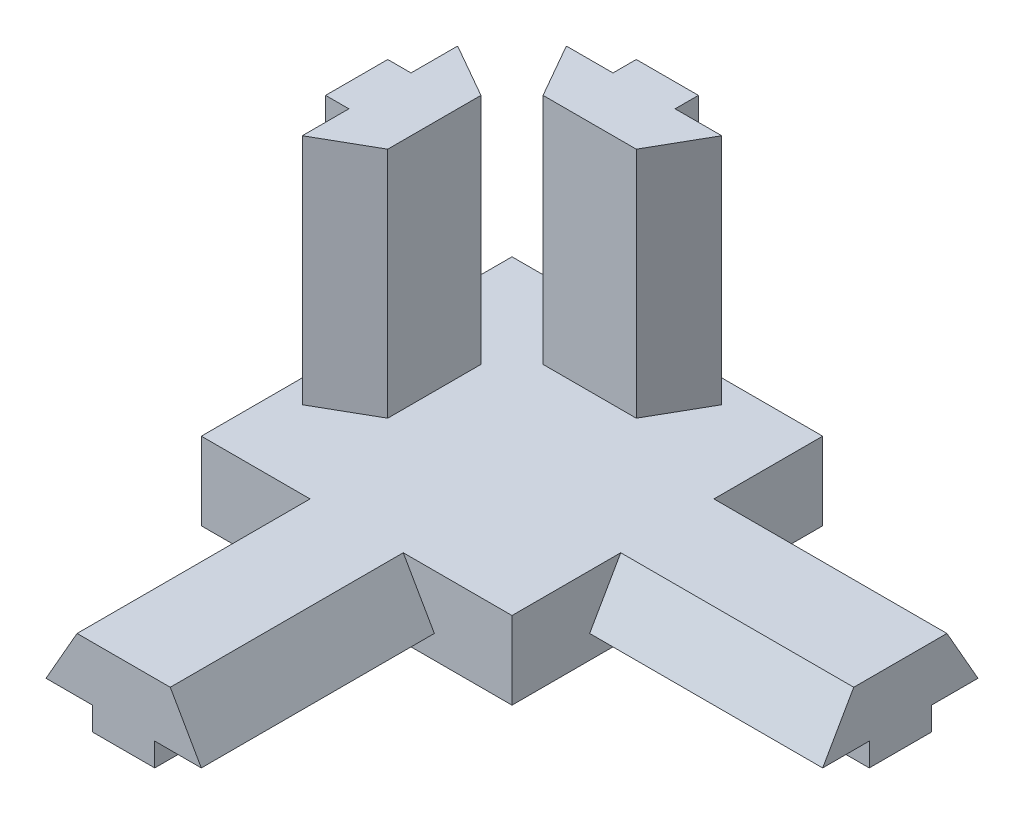
ISO-10303-21;
HEADER;
FILE_DESCRIPTION(('STEP AP214'),'2;1');
FILE_NAME('part.step','',(''),(''),'','','');
FILE_SCHEMA(('AUTOMOTIVE_DESIGN { 1 0 10303 214 1 1 1 1 }'));
ENDSEC;
DATA;
#1=APPLICATION_CONTEXT('core data for automotive mechanical design processes');
#2=APPLICATION_PROTOCOL_DEFINITION('international standard','automotive_design',2000,#1);
#3=PRODUCT_CONTEXT('',#1,'mechanical');
#4=PRODUCT('Part','Part','',(#3));
#5=PRODUCT_RELATED_PRODUCT_CATEGORY('part','',(#4));
#6=PRODUCT_DEFINITION_FORMATION('','',#4);
#7=PRODUCT_DEFINITION_CONTEXT('part definition',#1,'design');
#8=PRODUCT_DEFINITION('design','',#6,#7);
#9=PRODUCT_DEFINITION_SHAPE('','',#8);
#10=(LENGTH_UNIT() NAMED_UNIT(*) SI_UNIT(.MILLI.,.METRE.));
#11=(NAMED_UNIT(*) PLANE_ANGLE_UNIT() SI_UNIT($,.RADIAN.));
#12=(NAMED_UNIT(*) SI_UNIT($,.STERADIAN.) SOLID_ANGLE_UNIT());
#13=UNCERTAINTY_MEASURE_WITH_UNIT(LENGTH_MEASURE(1.E-05),#10,'distance_accuracy_value','');
#14=(GEOMETRIC_REPRESENTATION_CONTEXT(3) GLOBAL_UNCERTAINTY_ASSIGNED_CONTEXT((#13)) GLOBAL_UNIT_ASSIGNED_CONTEXT((#10,
#11,#12)) REPRESENTATION_CONTEXT('',''));
#15=CARTESIAN_POINT('',(0.,0.,0.));
#16=DIRECTION('',(0.,0.,1.));
#17=DIRECTION('',(1.,0.,0.));
#18=AXIS2_PLACEMENT_3D('',#15,#16,#17);
#19=CARTESIAN_POINT('',(-10.,2.5,10.));
#20=DIRECTION('',(0.,0.,-1.));
#21=DIRECTION('',(-1.,0.,0.));
#22=AXIS2_PLACEMENT_3D('',#19,#20,#21);
#23=PLANE('',#22);
#24=DIRECTION('',(-0.496138938356834,0.868243142124459,0.));
#25=VECTOR('',#24,1.);
#26=CARTESIAN_POINT('',(2.99999999999996,2.5,10.));
#27=LINE('',#26,#25);
#28=CARTESIAN_POINT('',(4.99999999999997,-1.,10.));
#29=VERTEX_POINT('',#28);
#30=CARTESIAN_POINT('',(2.99999999999996,2.5,10.));
#31=VERTEX_POINT('',#30);
#32=EDGE_CURVE('E55',#29,#31,#27,.T.);
#33=ORIENTED_EDGE('',*,*,#32,.F.);
#34=DIRECTION('',(1.,0.,0.));
#35=VECTOR('',#34,1.);
#36=CARTESIAN_POINT('',(4.99999999999997,-1.,10.));
#37=LINE('',#36,#35);
#38=CARTESIAN_POINT('',(1.99999999999997,-1.,10.));
#39=VERTEX_POINT('',#38);
#40=EDGE_CURVE('E59',#39,#29,#37,.T.);
#41=ORIENTED_EDGE('',*,*,#40,.F.);
#42=DIRECTION('',(0.,1.,0.));
#43=VECTOR('',#42,1.);
#44=CARTESIAN_POINT('',(1.99999999999997,-1.,10.));
#45=LINE('',#44,#43);
#46=CARTESIAN_POINT('',(1.99999999999997,-2.5,10.));
#47=VERTEX_POINT('',#46);
#48=EDGE_CURVE('E620',#47,#39,#45,.T.);
#49=ORIENTED_EDGE('',*,*,#48,.F.);
#50=DIRECTION('',(1.,0.,0.));
#51=VECTOR('',#50,1.);
#52=CARTESIAN_POINT('',(-10.,-2.5,10.));
#53=LINE('',#52,#51);
#54=CARTESIAN_POINT('',(10.,-2.5,10.));
#55=VERTEX_POINT('',#54);
#56=EDGE_CURVE('E583',#47,#55,#53,.T.);
#57=ORIENTED_EDGE('',*,*,#56,.T.);
#58=DIRECTION('',(0.,-1.,0.));
#59=VECTOR('',#58,1.);
#60=CARTESIAN_POINT('',(10.,2.5,10.));
#61=LINE('',#60,#59);
#62=CARTESIAN_POINT('',(10.,2.5,10.));
#63=VERTEX_POINT('',#62);
#64=EDGE_CURVE('E573',#63,#55,#61,.T.);
#65=ORIENTED_EDGE('',*,*,#64,.F.);
#66=DIRECTION('',(1.,0.,0.));
#67=VECTOR('',#66,1.);
#68=CARTESIAN_POINT('',(-10.,2.5,10.));
#69=LINE('',#68,#67);
#70=EDGE_CURVE('E568',#31,#63,#69,.T.);
#71=ORIENTED_EDGE('',*,*,#70,.F.);
#72=EDGE_LOOP('',(#33,#41,#49,#57,#65,#71));
#73=FACE_BOUND('',#72,.T.);
#74=ADVANCED_FACE('F39',(#73),#23,.F.);
#75=DIRECTION('',(-0.496138938356834,-0.868243142124459,0.));
#76=VECTOR('',#75,1.);
#77=CARTESIAN_POINT('',(-5.00000000000003,-1.,9.99999999999998));
#78=LINE('',#77,#76);
#79=CARTESIAN_POINT('',(-3.00000000000004,2.5,9.99999999999999));
#80=VERTEX_POINT('',#79);
#81=CARTESIAN_POINT('',(-5.00000000000003,-1.,9.99999999999998));
#82=VERTEX_POINT('',#81);
#83=EDGE_CURVE('E296',#80,#82,#78,.T.);
#84=ORIENTED_EDGE('',*,*,#83,.F.);
#85=CARTESIAN_POINT('',(-10.,2.5,10.));
#86=VERTEX_POINT('',#85);
#87=EDGE_CURVE('E569',#86,#80,#69,.T.);
#88=ORIENTED_EDGE('',*,*,#87,.F.);
#89=DIRECTION('',(0.,-1.,0.));
#90=VECTOR('',#89,1.);
#91=CARTESIAN_POINT('',(-10.,2.5,10.));
#92=LINE('',#91,#90);
#93=CARTESIAN_POINT('',(-10.,-2.5,10.));
#94=VERTEX_POINT('',#93);
#95=EDGE_CURVE('E590',#86,#94,#92,.T.);
#96=ORIENTED_EDGE('',*,*,#95,.T.);
#97=CARTESIAN_POINT('',(-2.00000000000004,-2.5,10.));
#98=VERTEX_POINT('',#97);
#99=EDGE_CURVE('E584',#94,#98,#53,.T.);
#100=ORIENTED_EDGE('',*,*,#99,.T.);
#101=DIRECTION('',(0.,-1.,0.));
#102=VECTOR('',#101,1.);
#103=CARTESIAN_POINT('',(-2.00000000000004,-2.5,9.99999999999999));
#104=LINE('',#103,#102);
#105=CARTESIAN_POINT('',(-2.00000000000004,-1.,9.99999999999999));
#106=VERTEX_POINT('',#105);
#107=EDGE_CURVE('E615',#106,#98,#104,.T.);
#108=ORIENTED_EDGE('',*,*,#107,.F.);
#109=DIRECTION('',(1.,0.,0.));
#110=VECTOR('',#109,1.);
#111=CARTESIAN_POINT('',(-2.00000000000004,-1.,9.99999999999999));
#112=LINE('',#111,#110);
#113=EDGE_CURVE('E621',#82,#106,#112,.T.);
#114=ORIENTED_EDGE('',*,*,#113,.F.);
#115=EDGE_LOOP('',(#84,#88,#96,#100,#108,#114));
#116=FACE_BOUND('',#115,.T.);
#117=ADVANCED_FACE('F614',(#116),#23,.F.);
#118=CARTESIAN_POINT('',(10.,2.5,10.));
#119=DIRECTION('',(-1.,0.,0.));
#120=DIRECTION('',(0.,0.,1.));
#121=AXIS2_PLACEMENT_3D('',#118,#119,#120);
#122=PLANE('',#121);
#123=DIRECTION('',(0.,0.868243142124459,0.496138938356834));
#124=VECTOR('',#123,1.);
#125=CARTESIAN_POINT('',(10.,2.5,-3.));
#126=LINE('',#125,#124);
#127=CARTESIAN_POINT('',(10.,-1.,-5.));
#128=VERTEX_POINT('',#127);
#129=CARTESIAN_POINT('',(10.,2.5,-3.));
#130=VERTEX_POINT('',#129);
#131=EDGE_CURVE('E314',#128,#130,#126,.T.);
#132=ORIENTED_EDGE('',*,*,#131,.F.);
#133=DIRECTION('',(0.,0.,-1.));
#134=VECTOR('',#133,1.);
#135=CARTESIAN_POINT('',(10.,-1.,-5.));
#136=LINE('',#135,#134);
#137=CARTESIAN_POINT('',(10.,-1.,-2.));
#138=VERTEX_POINT('',#137);
#139=EDGE_CURVE('E347',#138,#128,#136,.T.);
#140=ORIENTED_EDGE('',*,*,#139,.F.);
#141=DIRECTION('',(0.,1.,0.));
#142=VECTOR('',#141,1.);
#143=CARTESIAN_POINT('',(10.,-1.,-2.));
#144=LINE('',#143,#142);
#145=CARTESIAN_POINT('',(10.,-2.5,-2.));
#146=VERTEX_POINT('',#145);
#147=EDGE_CURVE('E343',#146,#138,#144,.T.);
#148=ORIENTED_EDGE('',*,*,#147,.F.);
#149=DIRECTION('',(0.,0.,-1.));
#150=VECTOR('',#149,1.);
#151=CARTESIAN_POINT('',(10.,-2.5,10.));
#152=LINE('',#151,#150);
#153=CARTESIAN_POINT('',(10.,-2.5,-10.));
#154=VERTEX_POINT('',#153);
#155=EDGE_CURVE('E532',#146,#154,#152,.T.);
#156=ORIENTED_EDGE('',*,*,#155,.T.);
#157=DIRECTION('',(0.,-1.,0.));
#158=VECTOR('',#157,1.);
#159=CARTESIAN_POINT('',(10.,2.5,-10.));
#160=LINE('',#159,#158);
#161=CARTESIAN_POINT('',(10.,2.5,-10.));
#162=VERTEX_POINT('',#161);
#163=EDGE_CURVE('E11',#162,#154,#160,.T.);
#164=ORIENTED_EDGE('',*,*,#163,.F.);
#165=DIRECTION('',(0.,0.,-1.));
#166=VECTOR('',#165,1.);
#167=CARTESIAN_POINT('',(10.,2.5,10.));
#168=LINE('',#167,#166);
#169=EDGE_CURVE('E558',#130,#162,#168,.T.);
#170=ORIENTED_EDGE('',*,*,#169,.F.);
#171=EDGE_LOOP('',(#132,#140,#148,#156,#164,#170));
#172=FACE_BOUND('',#171,.T.);
#173=ADVANCED_FACE('F41',(#172),#122,.F.);
#174=DIRECTION('',(0.,-0.868243142124459,0.496138938356834));
#175=VECTOR('',#174,1.);
#176=CARTESIAN_POINT('',(10.,-1.,5.));
#177=LINE('',#176,#175);
#178=CARTESIAN_POINT('',(10.,2.5,3.));
#179=VERTEX_POINT('',#178);
#180=CARTESIAN_POINT('',(10.,-1.,5.));
#181=VERTEX_POINT('',#180);
#182=EDGE_CURVE('E298',#179,#181,#177,.T.);
#183=ORIENTED_EDGE('',*,*,#182,.F.);
#184=EDGE_CURVE('E553',#63,#179,#168,.T.);
#185=ORIENTED_EDGE('',*,*,#184,.F.);
#186=ORIENTED_EDGE('',*,*,#64,.T.);
#187=CARTESIAN_POINT('',(10.,-2.5,2.));
#188=VERTEX_POINT('',#187);
#189=EDGE_CURVE('E574',#55,#188,#152,.T.);
#190=ORIENTED_EDGE('',*,*,#189,.T.);
#191=DIRECTION('',(0.,-1.,0.));
#192=VECTOR('',#191,1.);
#193=CARTESIAN_POINT('',(10.,-2.5,2.));
#194=LINE('',#193,#192);
#195=CARTESIAN_POINT('',(10.,-1.,2.));
#196=VERTEX_POINT('',#195);
#197=EDGE_CURVE('E339',#196,#188,#194,.T.);
#198=ORIENTED_EDGE('',*,*,#197,.F.);
#199=DIRECTION('',(0.,0.,-1.));
#200=VECTOR('',#199,1.);
#201=CARTESIAN_POINT('',(10.,-1.,2.));
#202=LINE('',#201,#200);
#203=EDGE_CURVE('E303',#181,#196,#202,.T.);
#204=ORIENTED_EDGE('',*,*,#203,.F.);
#205=EDGE_LOOP('',(#183,#185,#186,#190,#198,#204));
#206=FACE_BOUND('',#205,.T.);
#207=ADVANCED_FACE('F711',(#206),#122,.F.);
#208=CARTESIAN_POINT('',(-10.,2.5,-10.));
#209=DIRECTION('',(0.,0.,1.));
#210=DIRECTION('',(1.,0.,0.));
#211=AXIS2_PLACEMENT_3D('',#208,#209,#210);
#212=PLANE('',#211);
#213=DIRECTION('',(-1.,0.,0.));
#214=VECTOR('',#213,1.);
#215=CARTESIAN_POINT('',(-10.,-2.5,-10.));
#216=LINE('',#215,#214);
#217=CARTESIAN_POINT('',(-10.,-2.5,-10.));
#218=VERTEX_POINT('',#217);
#219=EDGE_CURVE('E577',#154,#218,#216,.T.);
#220=ORIENTED_EDGE('',*,*,#219,.T.);
#221=DIRECTION('',(0.,-1.,0.));
#222=VECTOR('',#221,1.);
#223=CARTESIAN_POINT('',(-10.,2.5,-10.));
#224=LINE('',#223,#222);
#225=CARTESIAN_POINT('',(-10.,2.5,-10.));
#226=VERTEX_POINT('',#225);
#227=EDGE_CURVE('E48',#226,#218,#224,.T.);
#228=ORIENTED_EDGE('',*,*,#227,.F.);
#229=DIRECTION('',(-1.,0.,0.));
#230=VECTOR('',#229,1.);
#231=CARTESIAN_POINT('',(-10.,2.5,-10.));
#232=LINE('',#231,#230);
#233=CARTESIAN_POINT('',(-2.,2.5,-10.));
#234=VERTEX_POINT('',#233);
#235=EDGE_CURVE('E557',#234,#226,#232,.T.);
#236=ORIENTED_EDGE('',*,*,#235,.F.);
#237=DIRECTION('',(0.,-1.,0.));
#238=VECTOR('',#237,1.);
#239=CARTESIAN_POINT('',(-2.,17.5,-10.));
#240=LINE('',#239,#238);
#241=CARTESIAN_POINT('',(-2.,17.5,-10.));
#242=VERTEX_POINT('',#241);
#243=EDGE_CURVE('E533',#242,#234,#240,.T.);
#244=ORIENTED_EDGE('',*,*,#243,.F.);
#245=DIRECTION('',(1.,0.,0.));
#246=VECTOR('',#245,1.);
#247=CARTESIAN_POINT('',(-2.,17.5,-10.));
#248=LINE('',#247,#246);
#249=CARTESIAN_POINT('',(2.,17.5,-10.));
#250=VERTEX_POINT('',#249);
#251=EDGE_CURVE('E498',#242,#250,#248,.T.);
#252=ORIENTED_EDGE('',*,*,#251,.T.);
#253=DIRECTION('',(0.,-1.,0.));
#254=VECTOR('',#253,1.);
#255=CARTESIAN_POINT('',(2.,17.5,-10.));
#256=LINE('',#255,#254);
#257=CARTESIAN_POINT('',(2.,2.5,-10.));
#258=VERTEX_POINT('',#257);
#259=EDGE_CURVE('E529',#250,#258,#256,.T.);
#260=ORIENTED_EDGE('',*,*,#259,.T.);
#261=EDGE_CURVE('E559',#162,#258,#232,.T.);
#262=ORIENTED_EDGE('',*,*,#261,.F.);
#263=ORIENTED_EDGE('',*,*,#163,.T.);
#264=EDGE_LOOP('',(#220,#228,#236,#244,#252,#260,#262,#263));
#265=FACE_BOUND('',#264,.T.);
#266=ADVANCED_FACE('F731',(#265),#212,.F.);
#267=CARTESIAN_POINT('',(-10.,2.5,10.));
#268=DIRECTION('',(1.,0.,0.));
#269=DIRECTION('',(0.,0.,-1.));
#270=AXIS2_PLACEMENT_3D('',#267,#268,#269);
#271=PLANE('',#270);
#272=DIRECTION('',(0.,0.,1.));
#273=VECTOR('',#272,1.);
#274=CARTESIAN_POINT('',(-10.,-2.5,10.));
#275=LINE('',#274,#273);
#276=EDGE_CURVE('E580',#218,#94,#275,.T.);
#277=ORIENTED_EDGE('',*,*,#276,.T.);
#278=ORIENTED_EDGE('',*,*,#95,.F.);
#279=DIRECTION('',(0.,0.,1.));
#280=VECTOR('',#279,1.);
#281=CARTESIAN_POINT('',(-10.,2.5,10.));
#282=LINE('',#281,#280);
#283=CARTESIAN_POINT('',(-9.99999999999999,2.5,2.00000000000004));
#284=VERTEX_POINT('',#283);
#285=EDGE_CURVE('E563',#284,#86,#282,.T.);
#286=ORIENTED_EDGE('',*,*,#285,.F.);
#287=DIRECTION('',(0.,-1.,0.));
#288=VECTOR('',#287,1.);
#289=CARTESIAN_POINT('',(-9.99999999999999,17.5,2.00000000000004));
#290=LINE('',#289,#288);
#291=CARTESIAN_POINT('',(-9.99999999999999,17.5,2.00000000000004));
#292=VERTEX_POINT('',#291);
#293=EDGE_CURVE('E449',#292,#284,#290,.T.);
#294=ORIENTED_EDGE('',*,*,#293,.F.);
#295=DIRECTION('',(0.,0.,-1.));
#296=VECTOR('',#295,1.);
#297=CARTESIAN_POINT('',(-9.99999999999999,17.5,2.00000000000004));
#298=LINE('',#297,#296);
#299=CARTESIAN_POINT('',(-10.,17.5,-1.99999999999997));
#300=VERTEX_POINT('',#299);
#301=EDGE_CURVE('E414',#292,#300,#298,.T.);
#302=ORIENTED_EDGE('',*,*,#301,.T.);
#303=DIRECTION('',(0.,-1.,0.));
#304=VECTOR('',#303,1.);
#305=CARTESIAN_POINT('',(-10.,17.5,-1.99999999999997));
#306=LINE('',#305,#304);
#307=CARTESIAN_POINT('',(-10.,2.5,-1.99999999999997));
#308=VERTEX_POINT('',#307);
#309=EDGE_CURVE('E445',#300,#308,#306,.T.);
#310=ORIENTED_EDGE('',*,*,#309,.T.);
#311=EDGE_CURVE('E564',#226,#308,#282,.T.);
#312=ORIENTED_EDGE('',*,*,#311,.F.);
#313=ORIENTED_EDGE('',*,*,#227,.T.);
#314=EDGE_LOOP('',(#277,#278,#286,#294,#302,#310,#312,#313));
#315=FACE_BOUND('',#314,.T.);
#316=ADVANCED_FACE('F599',(#315),#271,.F.);
#317=CARTESIAN_POINT('',(0.,2.5,0.));
#318=DIRECTION('',(0.,-1.,0.));
#319=DIRECTION('',(0.,0.,-1.));
#320=AXIS2_PLACEMENT_3D('',#317,#318,#319);
#321=PLANE('',#320);
#322=ORIENTED_EDGE('',*,*,#311,.T.);
#323=DIRECTION('',(1.,0.,0.));
#324=VECTOR('',#323,1.);
#325=CARTESIAN_POINT('',(-10.,2.5,-1.99999999999997));
#326=LINE('',#325,#324);
#327=CARTESIAN_POINT('',(-8.50000000000001,2.5,-1.99999999999997));
#328=VERTEX_POINT('',#327);
#329=EDGE_CURVE('E385',#308,#328,#326,.T.);
#330=ORIENTED_EDGE('',*,*,#329,.T.);
#331=DIRECTION('',(0.,0.,-1.));
#332=VECTOR('',#331,1.);
#333=CARTESIAN_POINT('',(-8.50000000000001,2.5,-1.99999999999997));
#334=LINE('',#333,#332);
#335=CARTESIAN_POINT('',(-8.50000000000002,2.5,-4.99999999999997));
#336=VERTEX_POINT('',#335);
#337=EDGE_CURVE('E422',#328,#336,#334,.T.);
#338=ORIENTED_EDGE('',*,*,#337,.T.);
#339=DIRECTION('',(0.868243142124461,0.,0.496138938356831));
#340=VECTOR('',#339,1.);
#341=CARTESIAN_POINT('',(-8.50000000000002,2.5,-4.99999999999997));
#342=LINE('',#341,#340);
#343=CARTESIAN_POINT('',(-5.00000000000001,2.5,-2.99999999999998));
#344=VERTEX_POINT('',#343);
#345=EDGE_CURVE('E426',#336,#344,#342,.T.);
#346=ORIENTED_EDGE('',*,*,#345,.T.);
#347=DIRECTION('',(0.,0.,1.));
#348=VECTOR('',#347,1.);
#349=CARTESIAN_POINT('',(-5.00000000000001,2.5,-2.99999999999998));
#350=LINE('',#349,#348);
#351=CARTESIAN_POINT('',(-4.99999999999999,2.5,3.00000000000002));
#352=VERTEX_POINT('',#351);
#353=EDGE_CURVE('E430',#344,#352,#350,.T.);
#354=ORIENTED_EDGE('',*,*,#353,.T.);
#355=DIRECTION('',(0.868243142124458,0.,-0.496138938356836));
#356=VECTOR('',#355,1.);
#357=CARTESIAN_POINT('',(-8.49999999999998,2.5,5.00000000000003));
#358=LINE('',#357,#356);
#359=CARTESIAN_POINT('',(-8.49999999999998,2.5,5.00000000000003));
#360=VERTEX_POINT('',#359);
#361=EDGE_CURVE('E434',#360,#352,#358,.T.);
#362=ORIENTED_EDGE('',*,*,#361,.F.);
#363=DIRECTION('',(0.,0.,-1.));
#364=VECTOR('',#363,1.);
#365=CARTESIAN_POINT('',(-8.49999999999998,2.5,5.00000000000003));
#366=LINE('',#365,#364);
#367=CARTESIAN_POINT('',(-8.49999999999999,2.5,2.00000000000003));
#368=VERTEX_POINT('',#367);
#369=EDGE_CURVE('E438',#360,#368,#366,.T.);
#370=ORIENTED_EDGE('',*,*,#369,.T.);
#371=DIRECTION('',(-1.,0.,0.));
#372=VECTOR('',#371,1.);
#373=CARTESIAN_POINT('',(-8.49999999999999,2.5,2.00000000000003));
#374=LINE('',#373,#372);
#375=EDGE_CURVE('E391',#368,#284,#374,.T.);
#376=ORIENTED_EDGE('',*,*,#375,.T.);
#377=ORIENTED_EDGE('',*,*,#285,.T.);
#378=ORIENTED_EDGE('',*,*,#87,.T.);
#379=DIRECTION('',(0.,0.,-1.));
#380=VECTOR('',#379,1.);
#381=CARTESIAN_POINT('',(-3.00000000000009,2.5,25.));
#382=LINE('',#381,#380);
#383=CARTESIAN_POINT('',(-3.00000000000009,2.5,25.));
#384=VERTEX_POINT('',#383);
#385=EDGE_CURVE('E633',#384,#80,#382,.T.);
#386=ORIENTED_EDGE('',*,*,#385,.F.);
#387=DIRECTION('',(-1.,0.,0.));
#388=VECTOR('',#387,1.);
#389=CARTESIAN_POINT('',(-3.00000000000009,2.5,25.));
#390=LINE('',#389,#388);
#391=CARTESIAN_POINT('',(2.99999999999991,2.5,25.));
#392=VERTEX_POINT('',#391);
#393=EDGE_CURVE('E289',#392,#384,#390,.T.);
#394=ORIENTED_EDGE('',*,*,#393,.F.);
#395=DIRECTION('',(0.,0.,-1.));
#396=VECTOR('',#395,1.);
#397=CARTESIAN_POINT('',(2.99999999999991,2.5,25.));
#398=LINE('',#397,#396);
#399=EDGE_CURVE('E636',#392,#31,#398,.T.);
#400=ORIENTED_EDGE('',*,*,#399,.T.);
#401=ORIENTED_EDGE('',*,*,#70,.T.);
#402=ORIENTED_EDGE('',*,*,#184,.T.);
#403=DIRECTION('',(-1.,0.,0.));
#404=VECTOR('',#403,1.);
#405=CARTESIAN_POINT('',(25.,2.5,3.));
#406=LINE('',#405,#404);
#407=CARTESIAN_POINT('',(25.,2.5,3.));
#408=VERTEX_POINT('',#407);
#409=EDGE_CURVE('E334',#408,#179,#406,.T.);
#410=ORIENTED_EDGE('',*,*,#409,.F.);
#411=DIRECTION('',(0.,0.,1.));
#412=VECTOR('',#411,1.);
#413=CARTESIAN_POINT('',(25.,2.5,3.));
#414=LINE('',#413,#412);
#415=CARTESIAN_POINT('',(25.,2.5,-3.));
#416=VERTEX_POINT('',#415);
#417=EDGE_CURVE('E332',#416,#408,#414,.T.);
#418=ORIENTED_EDGE('',*,*,#417,.F.);
#419=DIRECTION('',(-1.,0.,0.));
#420=VECTOR('',#419,1.);
#421=CARTESIAN_POINT('',(25.,2.5,-3.));
#422=LINE('',#421,#420);
#423=EDGE_CURVE('E357',#416,#130,#422,.T.);
#424=ORIENTED_EDGE('',*,*,#423,.T.);
#425=ORIENTED_EDGE('',*,*,#169,.T.);
#426=ORIENTED_EDGE('',*,*,#261,.T.);
#427=DIRECTION('',(0.,0.,1.));
#428=VECTOR('',#427,1.);
#429=CARTESIAN_POINT('',(2.,2.5,-10.));
#430=LINE('',#429,#428);
#431=CARTESIAN_POINT('',(2.,2.5,-8.5));
#432=VERTEX_POINT('',#431);
#433=EDGE_CURVE('E448',#258,#432,#430,.T.);
#434=ORIENTED_EDGE('',*,*,#433,.T.);
#435=DIRECTION('',(1.,0.,0.));
#436=VECTOR('',#435,1.);
#437=CARTESIAN_POINT('',(2.,2.5,-8.5));
#438=LINE('',#437,#436);
#439=CARTESIAN_POINT('',(5.,2.5,-8.5));
#440=VERTEX_POINT('',#439);
#441=EDGE_CURVE('E506',#432,#440,#438,.T.);
#442=ORIENTED_EDGE('',*,*,#441,.T.);
#443=DIRECTION('',(-0.496138938356834,0.,0.868243142124459));
#444=VECTOR('',#443,1.);
#445=CARTESIAN_POINT('',(5.,2.5,-8.5));
#446=LINE('',#445,#444);
#447=CARTESIAN_POINT('',(3.,2.5,-5.));
#448=VERTEX_POINT('',#447);
#449=EDGE_CURVE('E510',#440,#448,#446,.T.);
#450=ORIENTED_EDGE('',*,*,#449,.T.);
#451=DIRECTION('',(-1.,0.,0.));
#452=VECTOR('',#451,1.);
#453=CARTESIAN_POINT('',(3.,2.5,-5.));
#454=LINE('',#453,#452);
#455=CARTESIAN_POINT('',(-3.,2.5,-5.));
#456=VERTEX_POINT('',#455);
#457=EDGE_CURVE('E514',#448,#456,#454,.T.);
#458=ORIENTED_EDGE('',*,*,#457,.T.);
#459=DIRECTION('',(0.496138938356833,0.,0.86824314212446));
#460=VECTOR('',#459,1.);
#461=CARTESIAN_POINT('',(-5.,2.5,-8.5));
#462=LINE('',#461,#460);
#463=CARTESIAN_POINT('',(-5.,2.5,-8.5));
#464=VERTEX_POINT('',#463);
#465=EDGE_CURVE('E518',#464,#456,#462,.T.);
#466=ORIENTED_EDGE('',*,*,#465,.F.);
#467=DIRECTION('',(1.,0.,0.));
#468=VECTOR('',#467,1.);
#469=CARTESIAN_POINT('',(-5.,2.5,-8.5));
#470=LINE('',#469,#468);
#471=CARTESIAN_POINT('',(-2.,2.5,-8.5));
#472=VERTEX_POINT('',#471);
#473=EDGE_CURVE('E522',#464,#472,#470,.T.);
#474=ORIENTED_EDGE('',*,*,#473,.T.);
#475=DIRECTION('',(0.,0.,-1.));
#476=VECTOR('',#475,1.);
#477=CARTESIAN_POINT('',(-2.,2.5,-8.5));
#478=LINE('',#477,#476);
#479=EDGE_CURVE('E475',#472,#234,#478,.T.);
#480=ORIENTED_EDGE('',*,*,#479,.T.);
#481=ORIENTED_EDGE('',*,*,#235,.T.);
#482=EDGE_LOOP('',(#322,#330,#338,#346,#354,#362,#370,#376,#377,#378,#386,#394,#400,#401,#402,
#410,#418,#424,#425,#426,#434,#442,#450,#458,#466,#474,#480,#481));
#483=FACE_BOUND('',#482,.T.);
#484=ADVANCED_FACE('F684',(#483),#321,.F.);
#485=CARTESIAN_POINT('',(0.,-2.5,0.));
#486=DIRECTION('',(0.,-1.,0.));
#487=DIRECTION('',(0.,0.,-1.));
#488=AXIS2_PLACEMENT_3D('',#485,#486,#487);
#489=PLANE('',#488);
#490=ORIENTED_EDGE('',*,*,#189,.F.);
#491=ORIENTED_EDGE('',*,*,#56,.F.);
#492=DIRECTION('',(0.,0.,-1.));
#493=VECTOR('',#492,1.);
#494=CARTESIAN_POINT('',(1.99999999999991,-2.5,25.));
#495=LINE('',#494,#493);
#496=CARTESIAN_POINT('',(1.99999999999991,-2.5,25.));
#497=VERTEX_POINT('',#496);
#498=EDGE_CURVE('E648',#497,#47,#495,.T.);
#499=ORIENTED_EDGE('',*,*,#498,.F.);
#500=DIRECTION('',(1.,0.,0.));
#501=VECTOR('',#500,1.);
#502=CARTESIAN_POINT('',(1.99999999999991,-2.5,25.));
#503=LINE('',#502,#501);
#504=CARTESIAN_POINT('',(-2.00000000000009,-2.5,25.));
#505=VERTEX_POINT('',#504);
#506=EDGE_CURVE('E663',#505,#497,#503,.T.);
#507=ORIENTED_EDGE('',*,*,#506,.F.);
#508=DIRECTION('',(0.,0.,-1.));
#509=VECTOR('',#508,1.);
#510=CARTESIAN_POINT('',(-2.00000000000009,-2.5,25.));
#511=LINE('',#510,#509);
#512=EDGE_CURVE('E305',#505,#98,#511,.T.);
#513=ORIENTED_EDGE('',*,*,#512,.T.);
#514=ORIENTED_EDGE('',*,*,#99,.F.);
#515=ORIENTED_EDGE('',*,*,#276,.F.);
#516=ORIENTED_EDGE('',*,*,#219,.F.);
#517=ORIENTED_EDGE('',*,*,#155,.F.);
#518=DIRECTION('',(-1.,0.,0.));
#519=VECTOR('',#518,1.);
#520=CARTESIAN_POINT('',(25.,-2.5,-2.));
#521=LINE('',#520,#519);
#522=CARTESIAN_POINT('',(25.,-2.5,-2.));
#523=VERTEX_POINT('',#522);
#524=EDGE_CURVE('E369',#523,#146,#521,.T.);
#525=ORIENTED_EDGE('',*,*,#524,.F.);
#526=DIRECTION('',(0.,0.,-1.));
#527=VECTOR('',#526,1.);
#528=CARTESIAN_POINT('',(25.,-2.5,-2.));
#529=LINE('',#528,#527);
#530=CARTESIAN_POINT('',(25.,-2.5,2.));
#531=VERTEX_POINT('',#530);
#532=EDGE_CURVE('E320',#531,#523,#529,.T.);
#533=ORIENTED_EDGE('',*,*,#532,.F.);
#534=DIRECTION('',(-1.,0.,0.));
#535=VECTOR('',#534,1.);
#536=CARTESIAN_POINT('',(25.,-2.5,2.));
#537=LINE('',#536,#535);
#538=EDGE_CURVE('E373',#531,#188,#537,.T.);
#539=ORIENTED_EDGE('',*,*,#538,.T.);
#540=EDGE_LOOP('',(#490,#491,#499,#507,#513,#514,#515,#516,#517,#525,#533,#539));
#541=FACE_BOUND('',#540,.T.);
#542=ADVANCED_FACE('F607',(#541),#489,.T.);
#543=CARTESIAN_POINT('',(2.,17.5,-10.));
#544=DIRECTION('',(1.,0.,0.));
#545=DIRECTION('',(0.,0.,-1.));
#546=AXIS2_PLACEMENT_3D('',#543,#544,#545);
#547=PLANE('',#546);
#548=ORIENTED_EDGE('',*,*,#433,.F.);
#549=ORIENTED_EDGE('',*,*,#259,.F.);
#550=DIRECTION('',(0.,0.,1.));
#551=VECTOR('',#550,1.);
#552=CARTESIAN_POINT('',(2.,17.5,-10.));
#553=LINE('',#552,#551);
#554=CARTESIAN_POINT('',(2.,17.5,-8.5));
#555=VERTEX_POINT('',#554);
#556=EDGE_CURVE('E470',#250,#555,#553,.T.);
#557=ORIENTED_EDGE('',*,*,#556,.T.);
#558=DIRECTION('',(0.,-1.,0.));
#559=VECTOR('',#558,1.);
#560=CARTESIAN_POINT('',(2.,17.5,-8.5));
#561=LINE('',#560,#559);
#562=EDGE_CURVE('E502',#555,#432,#561,.T.);
#563=ORIENTED_EDGE('',*,*,#562,.T.);
#564=EDGE_LOOP('',(#548,#549,#557,#563));
#565=FACE_BOUND('',#564,.T.);
#566=ADVANCED_FACE('F801',(#565),#547,.T.);
#567=CARTESIAN_POINT('',(-2.,17.5,-8.5));
#568=DIRECTION('',(-1.,0.,0.));
#569=DIRECTION('',(0.,0.,1.));
#570=AXIS2_PLACEMENT_3D('',#567,#568,#569);
#571=PLANE('',#570);
#572=ORIENTED_EDGE('',*,*,#479,.F.);
#573=DIRECTION('',(0.,-1.,0.));
#574=VECTOR('',#573,1.);
#575=CARTESIAN_POINT('',(-2.,17.5,-8.5));
#576=LINE('',#575,#574);
#577=CARTESIAN_POINT('',(-2.,17.5,-8.5));
#578=VERTEX_POINT('',#577);
#579=EDGE_CURVE('E536',#578,#472,#576,.T.);
#580=ORIENTED_EDGE('',*,*,#579,.F.);
#581=DIRECTION('',(0.,0.,-1.));
#582=VECTOR('',#581,1.);
#583=CARTESIAN_POINT('',(-2.,17.5,-8.5));
#584=LINE('',#583,#582);
#585=EDGE_CURVE('E494',#578,#242,#584,.T.);
#586=ORIENTED_EDGE('',*,*,#585,.T.);
#587=ORIENTED_EDGE('',*,*,#243,.T.);
#588=EDGE_LOOP('',(#572,#580,#586,#587));
#589=FACE_BOUND('',#588,.T.);
#590=ADVANCED_FACE('F797',(#589),#571,.T.);
#591=CARTESIAN_POINT('',(-5.,17.5,-8.5));
#592=DIRECTION('',(0.,0.,-1.));
#593=DIRECTION('',(-1.,0.,0.));
#594=AXIS2_PLACEMENT_3D('',#591,#592,#593);
#595=PLANE('',#594);
#596=ORIENTED_EDGE('',*,*,#473,.F.);
#597=DIRECTION('',(0.,-1.,0.));
#598=VECTOR('',#597,1.);
#599=CARTESIAN_POINT('',(-5.,17.5,-8.5));
#600=LINE('',#599,#598);
#601=CARTESIAN_POINT('',(-5.,17.5,-8.5));
#602=VERTEX_POINT('',#601);
#603=EDGE_CURVE('E539',#602,#464,#600,.T.);
#604=ORIENTED_EDGE('',*,*,#603,.F.);
#605=DIRECTION('',(1.,0.,0.));
#606=VECTOR('',#605,1.);
#607=CARTESIAN_POINT('',(-5.,17.5,-8.5));
#608=LINE('',#607,#606);
#609=EDGE_CURVE('E490',#602,#578,#608,.T.);
#610=ORIENTED_EDGE('',*,*,#609,.T.);
#611=ORIENTED_EDGE('',*,*,#579,.T.);
#612=EDGE_LOOP('',(#596,#604,#610,#611));
#613=FACE_BOUND('',#612,.T.);
#614=ADVANCED_FACE('F800',(#613),#595,.T.);
#615=CARTESIAN_POINT('',(-5.,17.5,-8.5));
#616=DIRECTION('',(0.86824314212446,0.,-0.496138938356833));
#617=DIRECTION('',(-0.496138938356833,0.,-0.86824314212446));
#618=AXIS2_PLACEMENT_3D('',#615,#616,#617);
#619=PLANE('',#618);
#620=ORIENTED_EDGE('',*,*,#465,.T.);
#621=DIRECTION('',(0.,-1.,0.));
#622=VECTOR('',#621,1.);
#623=CARTESIAN_POINT('',(-3.,17.5,-5.));
#624=LINE('',#623,#622);
#625=CARTESIAN_POINT('',(-3.,17.5,-5.));
#626=VERTEX_POINT('',#625);
#627=EDGE_CURVE('E542',#626,#456,#624,.T.);
#628=ORIENTED_EDGE('',*,*,#627,.F.);
#629=DIRECTION('',(0.496138938356833,0.,0.86824314212446));
#630=VECTOR('',#629,1.);
#631=CARTESIAN_POINT('',(-5.,17.5,-8.5));
#632=LINE('',#631,#630);
#633=EDGE_CURVE('E487',#602,#626,#632,.T.);
#634=ORIENTED_EDGE('',*,*,#633,.F.);
#635=ORIENTED_EDGE('',*,*,#603,.T.);
#636=EDGE_LOOP('',(#620,#628,#634,#635));
#637=FACE_BOUND('',#636,.T.);
#638=ADVANCED_FACE('F805',(#637),#619,.F.);
#639=CARTESIAN_POINT('',(3.,17.5,-5.));
#640=DIRECTION('',(0.,0.,1.));
#641=DIRECTION('',(1.,0.,0.));
#642=AXIS2_PLACEMENT_3D('',#639,#640,#641);
#643=PLANE('',#642);
#644=ORIENTED_EDGE('',*,*,#457,.F.);
#645=DIRECTION('',(0.,-1.,0.));
#646=VECTOR('',#645,1.);
#647=CARTESIAN_POINT('',(3.,17.5,-5.));
#648=LINE('',#647,#646);
#649=CARTESIAN_POINT('',(3.,17.5,-5.));
#650=VERTEX_POINT('',#649);
#651=EDGE_CURVE('E545',#650,#448,#648,.T.);
#652=ORIENTED_EDGE('',*,*,#651,.F.);
#653=DIRECTION('',(-1.,0.,0.));
#654=VECTOR('',#653,1.);
#655=CARTESIAN_POINT('',(3.,17.5,-5.));
#656=LINE('',#655,#654);
#657=EDGE_CURVE('E483',#650,#626,#656,.T.);
#658=ORIENTED_EDGE('',*,*,#657,.T.);
#659=ORIENTED_EDGE('',*,*,#627,.T.);
#660=EDGE_LOOP('',(#644,#652,#658,#659));
#661=FACE_BOUND('',#660,.T.);
#662=ADVANCED_FACE('F809',(#661),#643,.T.);
#663=CARTESIAN_POINT('',(5.,17.5,-8.5));
#664=DIRECTION('',(0.868243142124459,0.,0.496138938356834));
#665=DIRECTION('',(0.496138938356834,0.,-0.868243142124459));
#666=AXIS2_PLACEMENT_3D('',#663,#664,#665);
#667=PLANE('',#666);
#668=ORIENTED_EDGE('',*,*,#449,.F.);
#669=DIRECTION('',(0.,-1.,0.));
#670=VECTOR('',#669,1.);
#671=CARTESIAN_POINT('',(5.,17.5,-8.5));
#672=LINE('',#671,#670);
#673=CARTESIAN_POINT('',(5.,17.5,-8.5));
#674=VERTEX_POINT('',#673);
#675=EDGE_CURVE('E548',#674,#440,#672,.T.);
#676=ORIENTED_EDGE('',*,*,#675,.F.);
#677=DIRECTION('',(-0.496138938356834,0.,0.868243142124459));
#678=VECTOR('',#677,1.);
#679=CARTESIAN_POINT('',(5.,17.5,-8.5));
#680=LINE('',#679,#678);
#681=EDGE_CURVE('E479',#674,#650,#680,.T.);
#682=ORIENTED_EDGE('',*,*,#681,.T.);
#683=ORIENTED_EDGE('',*,*,#651,.T.);
#684=EDGE_LOOP('',(#668,#676,#682,#683));
#685=FACE_BOUND('',#684,.T.);
#686=ADVANCED_FACE('F813',(#685),#667,.T.);
#687=CARTESIAN_POINT('',(2.,17.5,-8.5));
#688=DIRECTION('',(0.,0.,-1.));
#689=DIRECTION('',(-1.,0.,0.));
#690=AXIS2_PLACEMENT_3D('',#687,#688,#689);
#691=PLANE('',#690);
#692=ORIENTED_EDGE('',*,*,#441,.F.);
#693=ORIENTED_EDGE('',*,*,#562,.F.);
#694=DIRECTION('',(1.,0.,0.));
#695=VECTOR('',#694,1.);
#696=CARTESIAN_POINT('',(2.,17.5,-8.5));
#697=LINE('',#696,#695);
#698=EDGE_CURVE('E474',#555,#674,#697,.T.);
#699=ORIENTED_EDGE('',*,*,#698,.T.);
#700=ORIENTED_EDGE('',*,*,#675,.T.);
#701=EDGE_LOOP('',(#692,#693,#699,#700));
#702=FACE_BOUND('',#701,.T.);
#703=ADVANCED_FACE('F795',(#702),#691,.T.);
#704=CARTESIAN_POINT('',(0.,17.5,0.));
#705=DIRECTION('',(0.,1.,0.));
#706=DIRECTION('',(0.,0.,1.));
#707=AXIS2_PLACEMENT_3D('',#704,#705,#706);
#708=PLANE('',#707);
#709=ORIENTED_EDGE('',*,*,#556,.F.);
#710=ORIENTED_EDGE('',*,*,#251,.F.);
#711=ORIENTED_EDGE('',*,*,#585,.F.);
#712=ORIENTED_EDGE('',*,*,#609,.F.);
#713=ORIENTED_EDGE('',*,*,#633,.T.);
#714=ORIENTED_EDGE('',*,*,#657,.F.);
#715=ORIENTED_EDGE('',*,*,#681,.F.);
#716=ORIENTED_EDGE('',*,*,#698,.F.);
#717=EDGE_LOOP('',(#709,#710,#711,#712,#713,#714,#715,#716));
#718=FACE_BOUND('',#717,.T.);
#719=ADVANCED_FACE('F791',(#718),#708,.T.);
#720=CARTESIAN_POINT('',(-10.,17.5,-1.99999999999997));
#721=DIRECTION('',(0.,0.,-1.));
#722=DIRECTION('',(-1.,0.,0.));
#723=AXIS2_PLACEMENT_3D('',#720,#721,#722);
#724=PLANE('',#723);
#725=ORIENTED_EDGE('',*,*,#329,.F.);
#726=ORIENTED_EDGE('',*,*,#309,.F.);
#727=DIRECTION('',(1.,0.,0.));
#728=VECTOR('',#727,1.);
#729=CARTESIAN_POINT('',(-10.,17.5,-1.99999999999997));
#730=LINE('',#729,#728);
#731=CARTESIAN_POINT('',(-8.50000000000001,17.5,-1.99999999999997));
#732=VERTEX_POINT('',#731);
#733=EDGE_CURVE('E386',#300,#732,#730,.T.);
#734=ORIENTED_EDGE('',*,*,#733,.T.);
#735=DIRECTION('',(0.,-1.,0.));
#736=VECTOR('',#735,1.);
#737=CARTESIAN_POINT('',(-8.50000000000001,17.5,-1.99999999999997));
#738=LINE('',#737,#736);
#739=EDGE_CURVE('E418',#732,#328,#738,.T.);
#740=ORIENTED_EDGE('',*,*,#739,.T.);
#741=EDGE_LOOP('',(#725,#726,#734,#740));
#742=FACE_BOUND('',#741,.T.);
#743=ADVANCED_FACE('F769',(#742),#724,.T.);
#744=CARTESIAN_POINT('',(-8.49999999999999,17.5,2.00000000000003));
#745=DIRECTION('',(0.,0.,1.));
#746=DIRECTION('',(1.,0.,0.));
#747=AXIS2_PLACEMENT_3D('',#744,#745,#746);
#748=PLANE('',#747);
#749=ORIENTED_EDGE('',*,*,#375,.F.);
#750=DIRECTION('',(0.,-1.,0.));
#751=VECTOR('',#750,1.);
#752=CARTESIAN_POINT('',(-8.49999999999999,17.5,2.00000000000003));
#753=LINE('',#752,#751);
#754=CARTESIAN_POINT('',(-8.49999999999999,17.5,2.00000000000003));
#755=VERTEX_POINT('',#754);
#756=EDGE_CURVE('E452',#755,#368,#753,.T.);
#757=ORIENTED_EDGE('',*,*,#756,.F.);
#758=DIRECTION('',(-1.,0.,0.));
#759=VECTOR('',#758,1.);
#760=CARTESIAN_POINT('',(-8.49999999999999,17.5,2.00000000000003));
#761=LINE('',#760,#759);
#762=EDGE_CURVE('E410',#755,#292,#761,.T.);
#763=ORIENTED_EDGE('',*,*,#762,.T.);
#764=ORIENTED_EDGE('',*,*,#293,.T.);
#765=EDGE_LOOP('',(#749,#757,#763,#764));
#766=FACE_BOUND('',#765,.T.);
#767=ADVANCED_FACE('F765',(#766),#748,.T.);
#768=CARTESIAN_POINT('',(-8.49999999999998,17.5,5.00000000000003));
#769=DIRECTION('',(-1.,0.,0.));
#770=DIRECTION('',(0.,0.,1.));
#771=AXIS2_PLACEMENT_3D('',#768,#769,#770);
#772=PLANE('',#771);
#773=ORIENTED_EDGE('',*,*,#369,.F.);
#774=DIRECTION('',(0.,-1.,0.));
#775=VECTOR('',#774,1.);
#776=CARTESIAN_POINT('',(-8.49999999999998,17.5,5.00000000000003));
#777=LINE('',#776,#775);
#778=CARTESIAN_POINT('',(-8.49999999999998,17.5,5.00000000000003));
#779=VERTEX_POINT('',#778);
#780=EDGE_CURVE('E455',#779,#360,#777,.T.);
#781=ORIENTED_EDGE('',*,*,#780,.F.);
#782=DIRECTION('',(0.,0.,-1.));
#783=VECTOR('',#782,1.);
#784=CARTESIAN_POINT('',(-8.49999999999998,17.5,5.00000000000003));
#785=LINE('',#784,#783);
#786=EDGE_CURVE('E406',#779,#755,#785,.T.);
#787=ORIENTED_EDGE('',*,*,#786,.T.);
#788=ORIENTED_EDGE('',*,*,#756,.T.);
#789=EDGE_LOOP('',(#773,#781,#787,#788));
#790=FACE_BOUND('',#789,.T.);
#791=ADVANCED_FACE('F768',(#790),#772,.T.);
#792=CARTESIAN_POINT('',(-8.49999999999998,17.5,5.00000000000003));
#793=DIRECTION('',(-0.496138938356836,0.,-0.868243142124458));
#794=DIRECTION('',(-0.868243142124458,0.,0.496138938356836));
#795=AXIS2_PLACEMENT_3D('',#792,#793,#794);
#796=PLANE('',#795);
#797=ORIENTED_EDGE('',*,*,#361,.T.);
#798=DIRECTION('',(0.,-1.,0.));
#799=VECTOR('',#798,1.);
#800=CARTESIAN_POINT('',(-4.99999999999999,17.5,3.00000000000002));
#801=LINE('',#800,#799);
#802=CARTESIAN_POINT('',(-4.99999999999999,17.5,3.00000000000002));
#803=VERTEX_POINT('',#802);
#804=EDGE_CURVE('E458',#803,#352,#801,.T.);
#805=ORIENTED_EDGE('',*,*,#804,.F.);
#806=DIRECTION('',(0.868243142124458,0.,-0.496138938356836));
#807=VECTOR('',#806,1.);
#808=CARTESIAN_POINT('',(-8.49999999999998,17.5,5.00000000000003));
#809=LINE('',#808,#807);
#810=EDGE_CURVE('E403',#779,#803,#809,.T.);
#811=ORIENTED_EDGE('',*,*,#810,.F.);
#812=ORIENTED_EDGE('',*,*,#780,.T.);
#813=EDGE_LOOP('',(#797,#805,#811,#812));
#814=FACE_BOUND('',#813,.T.);
#815=ADVANCED_FACE('F773',(#814),#796,.F.);
#816=CARTESIAN_POINT('',(-5.00000000000001,17.5,-2.99999999999998));
#817=DIRECTION('',(1.,0.,0.));
#818=DIRECTION('',(0.,0.,-1.));
#819=AXIS2_PLACEMENT_3D('',#816,#817,#818);
#820=PLANE('',#819);
#821=ORIENTED_EDGE('',*,*,#353,.F.);
#822=DIRECTION('',(0.,-1.,0.));
#823=VECTOR('',#822,1.);
#824=CARTESIAN_POINT('',(-5.00000000000001,17.5,-2.99999999999998));
#825=LINE('',#824,#823);
#826=CARTESIAN_POINT('',(-5.00000000000001,17.5,-2.99999999999998));
#827=VERTEX_POINT('',#826);
#828=EDGE_CURVE('E461',#827,#344,#825,.T.);
#829=ORIENTED_EDGE('',*,*,#828,.F.);
#830=DIRECTION('',(0.,0.,1.));
#831=VECTOR('',#830,1.);
#832=CARTESIAN_POINT('',(-5.00000000000001,17.5,-2.99999999999998));
#833=LINE('',#832,#831);
#834=EDGE_CURVE('E399',#827,#803,#833,.T.);
#835=ORIENTED_EDGE('',*,*,#834,.T.);
#836=ORIENTED_EDGE('',*,*,#804,.T.);
#837=EDGE_LOOP('',(#821,#829,#835,#836));
#838=FACE_BOUND('',#837,.T.);
#839=ADVANCED_FACE('F777',(#838),#820,.T.);
#840=CARTESIAN_POINT('',(-8.50000000000002,17.5,-4.99999999999997));
#841=DIRECTION('',(0.496138938356831,0.,-0.868243142124461));
#842=DIRECTION('',(-0.868243142124461,0.,-0.496138938356831));
#843=AXIS2_PLACEMENT_3D('',#840,#841,#842);
#844=PLANE('',#843);
#845=ORIENTED_EDGE('',*,*,#345,.F.);
#846=DIRECTION('',(0.,-1.,0.));
#847=VECTOR('',#846,1.);
#848=CARTESIAN_POINT('',(-8.50000000000002,17.5,-4.99999999999997));
#849=LINE('',#848,#847);
#850=CARTESIAN_POINT('',(-8.50000000000002,17.5,-4.99999999999997));
#851=VERTEX_POINT('',#850);
#852=EDGE_CURVE('E464',#851,#336,#849,.T.);
#853=ORIENTED_EDGE('',*,*,#852,.F.);
#854=DIRECTION('',(0.868243142124461,0.,0.496138938356831));
#855=VECTOR('',#854,1.);
#856=CARTESIAN_POINT('',(-8.50000000000002,17.5,-4.99999999999997));
#857=LINE('',#856,#855);
#858=EDGE_CURVE('E395',#851,#827,#857,.T.);
#859=ORIENTED_EDGE('',*,*,#858,.T.);
#860=ORIENTED_EDGE('',*,*,#828,.T.);
#861=EDGE_LOOP('',(#845,#853,#859,#860));
#862=FACE_BOUND('',#861,.T.);
#863=ADVANCED_FACE('F781',(#862),#844,.T.);
#864=CARTESIAN_POINT('',(-8.50000000000001,17.5,-1.99999999999997));
#865=DIRECTION('',(-1.,0.,0.));
#866=DIRECTION('',(0.,0.,1.));
#867=AXIS2_PLACEMENT_3D('',#864,#865,#866);
#868=PLANE('',#867);
#869=ORIENTED_EDGE('',*,*,#337,.F.);
#870=ORIENTED_EDGE('',*,*,#739,.F.);
#871=DIRECTION('',(0.,0.,-1.));
#872=VECTOR('',#871,1.);
#873=CARTESIAN_POINT('',(-8.50000000000001,17.5,-1.99999999999997));
#874=LINE('',#873,#872);
#875=EDGE_CURVE('E390',#732,#851,#874,.T.);
#876=ORIENTED_EDGE('',*,*,#875,.T.);
#877=ORIENTED_EDGE('',*,*,#852,.T.);
#878=EDGE_LOOP('',(#869,#870,#876,#877));
#879=FACE_BOUND('',#878,.T.);
#880=ADVANCED_FACE('F763',(#879),#868,.T.);
#881=CARTESIAN_POINT('',(0.,17.5,0.));
#882=DIRECTION('',(0.,1.,0.));
#883=DIRECTION('',(1.,0.,0.));
#884=AXIS2_PLACEMENT_3D('',#881,#882,#883);
#885=PLANE('',#884);
#886=ORIENTED_EDGE('',*,*,#733,.F.);
#887=ORIENTED_EDGE('',*,*,#301,.F.);
#888=ORIENTED_EDGE('',*,*,#762,.F.);
#889=ORIENTED_EDGE('',*,*,#786,.F.);
#890=ORIENTED_EDGE('',*,*,#810,.T.);
#891=ORIENTED_EDGE('',*,*,#834,.F.);
#892=ORIENTED_EDGE('',*,*,#858,.F.);
#893=ORIENTED_EDGE('',*,*,#875,.F.);
#894=EDGE_LOOP('',(#886,#887,#888,#889,#890,#891,#892,#893));
#895=FACE_BOUND('',#894,.T.);
#896=ADVANCED_FACE('F760',(#895),#885,.T.);
#897=CARTESIAN_POINT('',(25.,-1.,5.));
#898=DIRECTION('',(0.,-0.496138938356834,-0.868243142124459));
#899=DIRECTION('',(0.,0.868243142124459,-0.496138938356834));
#900=AXIS2_PLACEMENT_3D('',#897,#898,#899);
#901=PLANE('',#900);
#902=ORIENTED_EDGE('',*,*,#182,.T.);
#903=DIRECTION('',(-1.,0.,0.));
#904=VECTOR('',#903,1.);
#905=CARTESIAN_POINT('',(25.,-1.,5.));
#906=LINE('',#905,#904);
#907=CARTESIAN_POINT('',(25.,-1.,5.));
#908=VERTEX_POINT('',#907);
#909=EDGE_CURVE('E381',#908,#181,#906,.T.);
#910=ORIENTED_EDGE('',*,*,#909,.F.);
#911=DIRECTION('',(0.,-0.868243142124459,0.496138938356834));
#912=VECTOR('',#911,1.);
#913=CARTESIAN_POINT('',(25.,-1.,5.));
#914=LINE('',#913,#912);
#915=EDGE_CURVE('E309',#408,#908,#914,.T.);
#916=ORIENTED_EDGE('',*,*,#915,.F.);
#917=ORIENTED_EDGE('',*,*,#409,.T.);
#918=EDGE_LOOP('',(#902,#910,#916,#917));
#919=FACE_BOUND('',#918,.T.);
#920=ADVANCED_FACE('F717',(#919),#901,.F.);
#921=CARTESIAN_POINT('',(25.,-1.,2.));
#922=DIRECTION('',(0.,1.,0.));
#923=DIRECTION('',(0.,0.,1.));
#924=AXIS2_PLACEMENT_3D('',#921,#922,#923);
#925=PLANE('',#924);
#926=ORIENTED_EDGE('',*,*,#203,.T.);
#927=DIRECTION('',(-1.,0.,0.));
#928=VECTOR('',#927,1.);
#929=CARTESIAN_POINT('',(25.,-1.,2.));
#930=LINE('',#929,#928);
#931=CARTESIAN_POINT('',(25.,-1.,2.));
#932=VERTEX_POINT('',#931);
#933=EDGE_CURVE('E377',#932,#196,#930,.T.);
#934=ORIENTED_EDGE('',*,*,#933,.F.);
#935=DIRECTION('',(0.,0.,-1.));
#936=VECTOR('',#935,1.);
#937=CARTESIAN_POINT('',(25.,-1.,2.));
#938=LINE('',#937,#936);
#939=EDGE_CURVE('E313',#908,#932,#938,.T.);
#940=ORIENTED_EDGE('',*,*,#939,.F.);
#941=ORIENTED_EDGE('',*,*,#909,.T.);
#942=EDGE_LOOP('',(#926,#934,#940,#941));
#943=FACE_BOUND('',#942,.T.);
#944=ADVANCED_FACE('F713',(#943),#925,.F.);
#945=CARTESIAN_POINT('',(25.,-2.5,2.));
#946=DIRECTION('',(0.,0.,-1.));
#947=DIRECTION('',(0.,1.,0.));
#948=AXIS2_PLACEMENT_3D('',#945,#946,#947);
#949=PLANE('',#948);
#950=ORIENTED_EDGE('',*,*,#197,.T.);
#951=ORIENTED_EDGE('',*,*,#538,.F.);
#952=DIRECTION('',(0.,-1.,0.));
#953=VECTOR('',#952,1.);
#954=CARTESIAN_POINT('',(25.,-2.5,2.));
#955=LINE('',#954,#953);
#956=EDGE_CURVE('E317',#932,#531,#955,.T.);
#957=ORIENTED_EDGE('',*,*,#956,.F.);
#958=ORIENTED_EDGE('',*,*,#933,.T.);
#959=EDGE_LOOP('',(#950,#951,#957,#958));
#960=FACE_BOUND('',#959,.T.);
#961=ADVANCED_FACE('F708',(#960),#949,.F.);
#962=CARTESIAN_POINT('',(25.,-1.,-2.));
#963=DIRECTION('',(0.,0.,1.));
#964=DIRECTION('',(0.,-1.,0.));
#965=AXIS2_PLACEMENT_3D('',#962,#963,#964);
#966=PLANE('',#965);
#967=ORIENTED_EDGE('',*,*,#147,.T.);
#968=DIRECTION('',(-1.,0.,0.));
#969=VECTOR('',#968,1.);
#970=CARTESIAN_POINT('',(25.,-1.,-2.));
#971=LINE('',#970,#969);
#972=CARTESIAN_POINT('',(25.,-1.,-2.));
#973=VERTEX_POINT('',#972);
#974=EDGE_CURVE('E365',#973,#138,#971,.T.);
#975=ORIENTED_EDGE('',*,*,#974,.F.);
#976=DIRECTION('',(0.,1.,0.));
#977=VECTOR('',#976,1.);
#978=CARTESIAN_POINT('',(25.,-1.,-2.));
#979=LINE('',#978,#977);
#980=EDGE_CURVE('E323',#523,#973,#979,.T.);
#981=ORIENTED_EDGE('',*,*,#980,.F.);
#982=ORIENTED_EDGE('',*,*,#524,.T.);
#983=EDGE_LOOP('',(#967,#975,#981,#982));
#984=FACE_BOUND('',#983,.T.);
#985=ADVANCED_FACE('F699',(#984),#966,.F.);
#986=CARTESIAN_POINT('',(25.,-1.,-5.));
#987=DIRECTION('',(0.,1.,0.));
#988=DIRECTION('',(0.,0.,1.));
#989=AXIS2_PLACEMENT_3D('',#986,#987,#988);
#990=PLANE('',#989);
#991=ORIENTED_EDGE('',*,*,#139,.T.);
#992=DIRECTION('',(-1.,0.,0.));
#993=VECTOR('',#992,1.);
#994=CARTESIAN_POINT('',(25.,-1.,-5.));
#995=LINE('',#994,#993);
#996=CARTESIAN_POINT('',(25.,-1.,-5.));
#997=VERTEX_POINT('',#996);
#998=EDGE_CURVE('E361',#997,#128,#995,.T.);
#999=ORIENTED_EDGE('',*,*,#998,.F.);
#1000=DIRECTION('',(0.,0.,-1.));
#1001=VECTOR('',#1000,1.);
#1002=CARTESIAN_POINT('',(25.,-1.,-5.));
#1003=LINE('',#1002,#1001);
#1004=EDGE_CURVE('E326',#973,#997,#1003,.T.);
#1005=ORIENTED_EDGE('',*,*,#1004,.F.);
#1006=ORIENTED_EDGE('',*,*,#974,.T.);
#1007=EDGE_LOOP('',(#991,#999,#1005,#1006));
#1008=FACE_BOUND('',#1007,.T.);
#1009=ADVANCED_FACE('F743',(#1008),#990,.F.);
#1010=CARTESIAN_POINT('',(25.,2.5,-3.));
#1011=DIRECTION('',(0.,-0.496138938356834,0.868243142124459));
#1012=DIRECTION('',(0.,-0.868243142124459,-0.496138938356834));
#1013=AXIS2_PLACEMENT_3D('',#1010,#1011,#1012);
#1014=PLANE('',#1013);
#1015=ORIENTED_EDGE('',*,*,#131,.T.);
#1016=ORIENTED_EDGE('',*,*,#423,.F.);
#1017=DIRECTION('',(0.,0.868243142124459,0.496138938356834));
#1018=VECTOR('',#1017,1.);
#1019=CARTESIAN_POINT('',(25.,2.5,-3.));
#1020=LINE('',#1019,#1018);
#1021=EDGE_CURVE('E329',#997,#416,#1020,.T.);
#1022=ORIENTED_EDGE('',*,*,#1021,.F.);
#1023=ORIENTED_EDGE('',*,*,#998,.T.);
#1024=EDGE_LOOP('',(#1015,#1016,#1022,#1023));
#1025=FACE_BOUND('',#1024,.T.);
#1026=ADVANCED_FACE('F740',(#1025),#1014,.F.);
#1027=CARTESIAN_POINT('',(25.,0.,0.));
#1028=DIRECTION('',(-1.,0.,0.));
#1029=DIRECTION('',(0.,0.,1.));
#1030=AXIS2_PLACEMENT_3D('',#1027,#1028,#1029);
#1031=PLANE('',#1030);
#1032=ORIENTED_EDGE('',*,*,#915,.T.);
#1033=ORIENTED_EDGE('',*,*,#939,.T.);
#1034=ORIENTED_EDGE('',*,*,#956,.T.);
#1035=ORIENTED_EDGE('',*,*,#532,.T.);
#1036=ORIENTED_EDGE('',*,*,#980,.T.);
#1037=ORIENTED_EDGE('',*,*,#1004,.T.);
#1038=ORIENTED_EDGE('',*,*,#1021,.T.);
#1039=ORIENTED_EDGE('',*,*,#417,.T.);
#1040=EDGE_LOOP('',(#1032,#1033,#1034,#1035,#1036,#1037,#1038,#1039));
#1041=FACE_BOUND('',#1040,.T.);
#1042=ADVANCED_FACE('F703',(#1041),#1031,.F.);
#1043=CARTESIAN_POINT('',(-5.00000000000009,-1.,25.));
#1044=DIRECTION('',(0.868243142124459,-0.496138938356834,0.));
#1045=DIRECTION('',(0.496138938356834,0.868243142124459,0.));
#1046=AXIS2_PLACEMENT_3D('',#1043,#1044,#1045);
#1047=PLANE('',#1046);
#1048=ORIENTED_EDGE('',*,*,#83,.T.);
#1049=DIRECTION('',(0.,0.,-1.));
#1050=VECTOR('',#1049,1.);
#1051=CARTESIAN_POINT('',(-5.00000000000009,-1.,25.));
#1052=LINE('',#1051,#1050);
#1053=CARTESIAN_POINT('',(-5.00000000000009,-1.,25.));
#1054=VERTEX_POINT('',#1053);
#1055=EDGE_CURVE('E276',#1054,#82,#1052,.T.);
#1056=ORIENTED_EDGE('',*,*,#1055,.F.);
#1057=DIRECTION('',(-0.496138938356834,-0.868243142124459,0.));
#1058=VECTOR('',#1057,1.);
#1059=CARTESIAN_POINT('',(-5.00000000000009,-1.,25.));
#1060=LINE('',#1059,#1058);
#1061=EDGE_CURVE('E284',#384,#1054,#1060,.T.);
#1062=ORIENTED_EDGE('',*,*,#1061,.F.);
#1063=ORIENTED_EDGE('',*,*,#385,.T.);
#1064=EDGE_LOOP('',(#1048,#1056,#1062,#1063));
#1065=FACE_BOUND('',#1064,.T.);
#1066=ADVANCED_FACE('F295',(#1065),#1047,.F.);
#1067=CARTESIAN_POINT('',(-2.00000000000009,-1.,25.));
#1068=DIRECTION('',(0.,1.,0.));
#1069=DIRECTION('',(-1.,0.,0.));
#1070=AXIS2_PLACEMENT_3D('',#1067,#1068,#1069);
#1071=PLANE('',#1070);
#1072=ORIENTED_EDGE('',*,*,#113,.T.);
#1073=DIRECTION('',(0.,0.,-1.));
#1074=VECTOR('',#1073,1.);
#1075=CARTESIAN_POINT('',(-2.00000000000009,-1.,25.));
#1076=LINE('',#1075,#1074);
#1077=CARTESIAN_POINT('',(-2.00000000000009,-1.,25.));
#1078=VERTEX_POINT('',#1077);
#1079=EDGE_CURVE('E279',#1078,#106,#1076,.T.);
#1080=ORIENTED_EDGE('',*,*,#1079,.F.);
#1081=DIRECTION('',(1.,0.,0.));
#1082=VECTOR('',#1081,1.);
#1083=CARTESIAN_POINT('',(-2.00000000000009,-1.,25.));
#1084=LINE('',#1083,#1082);
#1085=EDGE_CURVE('E271',#1054,#1078,#1084,.T.);
#1086=ORIENTED_EDGE('',*,*,#1085,.F.);
#1087=ORIENTED_EDGE('',*,*,#1055,.T.);
#1088=EDGE_LOOP('',(#1072,#1080,#1086,#1087));
#1089=FACE_BOUND('',#1088,.T.);
#1090=ADVANCED_FACE('F274',(#1089),#1071,.F.);
#1091=CARTESIAN_POINT('',(-2.00000000000009,-2.5,25.));
#1092=DIRECTION('',(1.,0.,0.));
#1093=DIRECTION('',(0.,0.,-1.));
#1094=AXIS2_PLACEMENT_3D('',#1091,#1092,#1093);
#1095=PLANE('',#1094);
#1096=ORIENTED_EDGE('',*,*,#107,.T.);
#1097=ORIENTED_EDGE('',*,*,#512,.F.);
#1098=DIRECTION('',(0.,-1.,0.));
#1099=VECTOR('',#1098,1.);
#1100=CARTESIAN_POINT('',(-2.00000000000009,-2.5,25.));
#1101=LINE('',#1100,#1099);
#1102=EDGE_CURVE('E283',#1078,#505,#1101,.T.);
#1103=ORIENTED_EDGE('',*,*,#1102,.F.);
#1104=ORIENTED_EDGE('',*,*,#1079,.T.);
#1105=EDGE_LOOP('',(#1096,#1097,#1103,#1104));
#1106=FACE_BOUND('',#1105,.T.);
#1107=ADVANCED_FACE('F618',(#1106),#1095,.F.);
#1108=CARTESIAN_POINT('',(1.99999999999991,-1.,25.));
#1109=DIRECTION('',(-1.,0.,0.));
#1110=DIRECTION('',(0.,0.,1.));
#1111=AXIS2_PLACEMENT_3D('',#1108,#1109,#1110);
#1112=PLANE('',#1111);
#1113=ORIENTED_EDGE('',*,*,#48,.T.);
#1114=DIRECTION('',(0.,0.,-1.));
#1115=VECTOR('',#1114,1.);
#1116=CARTESIAN_POINT('',(1.99999999999991,-1.,25.));
#1117=LINE('',#1116,#1115);
#1118=CARTESIAN_POINT('',(1.99999999999991,-1.,25.));
#1119=VERTEX_POINT('',#1118);
#1120=EDGE_CURVE('E644',#1119,#39,#1117,.T.);
#1121=ORIENTED_EDGE('',*,*,#1120,.F.);
#1122=DIRECTION('',(0.,1.,0.));
#1123=VECTOR('',#1122,1.);
#1124=CARTESIAN_POINT('',(1.99999999999991,-1.,25.));
#1125=LINE('',#1124,#1123);
#1126=EDGE_CURVE('E660',#497,#1119,#1125,.T.);
#1127=ORIENTED_EDGE('',*,*,#1126,.F.);
#1128=ORIENTED_EDGE('',*,*,#498,.T.);
#1129=EDGE_LOOP('',(#1113,#1121,#1127,#1128));
#1130=FACE_BOUND('',#1129,.T.);
#1131=ADVANCED_FACE('F674',(#1130),#1112,.F.);
#1132=CARTESIAN_POINT('',(4.99999999999991,-1.,25.));
#1133=DIRECTION('',(0.,1.,0.));
#1134=DIRECTION('',(-1.,0.,0.));
#1135=AXIS2_PLACEMENT_3D('',#1132,#1133,#1134);
#1136=PLANE('',#1135);
#1137=ORIENTED_EDGE('',*,*,#40,.T.);
#1138=DIRECTION('',(0.,0.,-1.));
#1139=VECTOR('',#1138,1.);
#1140=CARTESIAN_POINT('',(4.99999999999991,-1.,25.));
#1141=LINE('',#1140,#1139);
#1142=CARTESIAN_POINT('',(4.99999999999991,-1.,25.));
#1143=VERTEX_POINT('',#1142);
#1144=EDGE_CURVE('E640',#1143,#29,#1141,.T.);
#1145=ORIENTED_EDGE('',*,*,#1144,.F.);
#1146=DIRECTION('',(1.,0.,0.));
#1147=VECTOR('',#1146,1.);
#1148=CARTESIAN_POINT('',(4.99999999999991,-1.,25.));
#1149=LINE('',#1148,#1147);
#1150=EDGE_CURVE('E657',#1119,#1143,#1149,.T.);
#1151=ORIENTED_EDGE('',*,*,#1150,.F.);
#1152=ORIENTED_EDGE('',*,*,#1120,.T.);
#1153=EDGE_LOOP('',(#1137,#1145,#1151,#1152));
#1154=FACE_BOUND('',#1153,.T.);
#1155=ADVANCED_FACE('F678',(#1154),#1136,.F.);
#1156=CARTESIAN_POINT('',(2.99999999999991,2.5,25.));
#1157=DIRECTION('',(-0.868243142124459,-0.496138938356834,0.));
#1158=DIRECTION('',(0.496138938356834,-0.868243142124459,0.));
#1159=AXIS2_PLACEMENT_3D('',#1156,#1157,#1158);
#1160=PLANE('',#1159);
#1161=ORIENTED_EDGE('',*,*,#32,.T.);
#1162=ORIENTED_EDGE('',*,*,#399,.F.);
#1163=DIRECTION('',(-0.496138938356834,0.868243142124459,0.));
#1164=VECTOR('',#1163,1.);
#1165=CARTESIAN_POINT('',(2.99999999999991,2.5,25.));
#1166=LINE('',#1165,#1164);
#1167=EDGE_CURVE('E654',#1143,#392,#1166,.T.);
#1168=ORIENTED_EDGE('',*,*,#1167,.F.);
#1169=ORIENTED_EDGE('',*,*,#1144,.T.);
#1170=EDGE_LOOP('',(#1161,#1162,#1168,#1169));
#1171=FACE_BOUND('',#1170,.T.);
#1172=ADVANCED_FACE('F682',(#1171),#1160,.F.);
#1173=CARTESIAN_POINT('',(0.,0.,25.));
#1174=DIRECTION('',(0.,0.,-1.));
#1175=DIRECTION('',(-1.,0.,0.));
#1176=AXIS2_PLACEMENT_3D('',#1173,#1174,#1175);
#1177=PLANE('',#1176);
#1178=ORIENTED_EDGE('',*,*,#1061,.T.);
#1179=ORIENTED_EDGE('',*,*,#1085,.T.);
#1180=ORIENTED_EDGE('',*,*,#1102,.T.);
#1181=ORIENTED_EDGE('',*,*,#506,.T.);
#1182=ORIENTED_EDGE('',*,*,#1126,.T.);
#1183=ORIENTED_EDGE('',*,*,#1150,.T.);
#1184=ORIENTED_EDGE('',*,*,#1167,.T.);
#1185=ORIENTED_EDGE('',*,*,#393,.T.);
#1186=EDGE_LOOP('',(#1178,#1179,#1180,#1181,#1182,#1183,#1184,#1185));
#1187=FACE_BOUND('',#1186,.T.);
#1188=ADVANCED_FACE('F287',(#1187),#1177,.F.);
#1189=CLOSED_SHELL('',(#74,#117,#173,#207,#266,#316,#484,#542,#566,#590,#614,#638,#662,#686,
#703,#719,#743,#767,#791,#815,#839,#863,#880,#896,#920,#944,#961,#985,#1009,#1026,#1042,#1066,
#1090,#1107,#1131,#1155,#1172,#1188));
#1190=MANIFOLD_SOLID_BREP('B2',#1189);
#1191=ADVANCED_BREP_SHAPE_REPRESENTATION('',(#18,#1190),#14);
#1192=SHAPE_DEFINITION_REPRESENTATION(#9,#1191);
ENDSEC;
END-ISO-10303-21;
